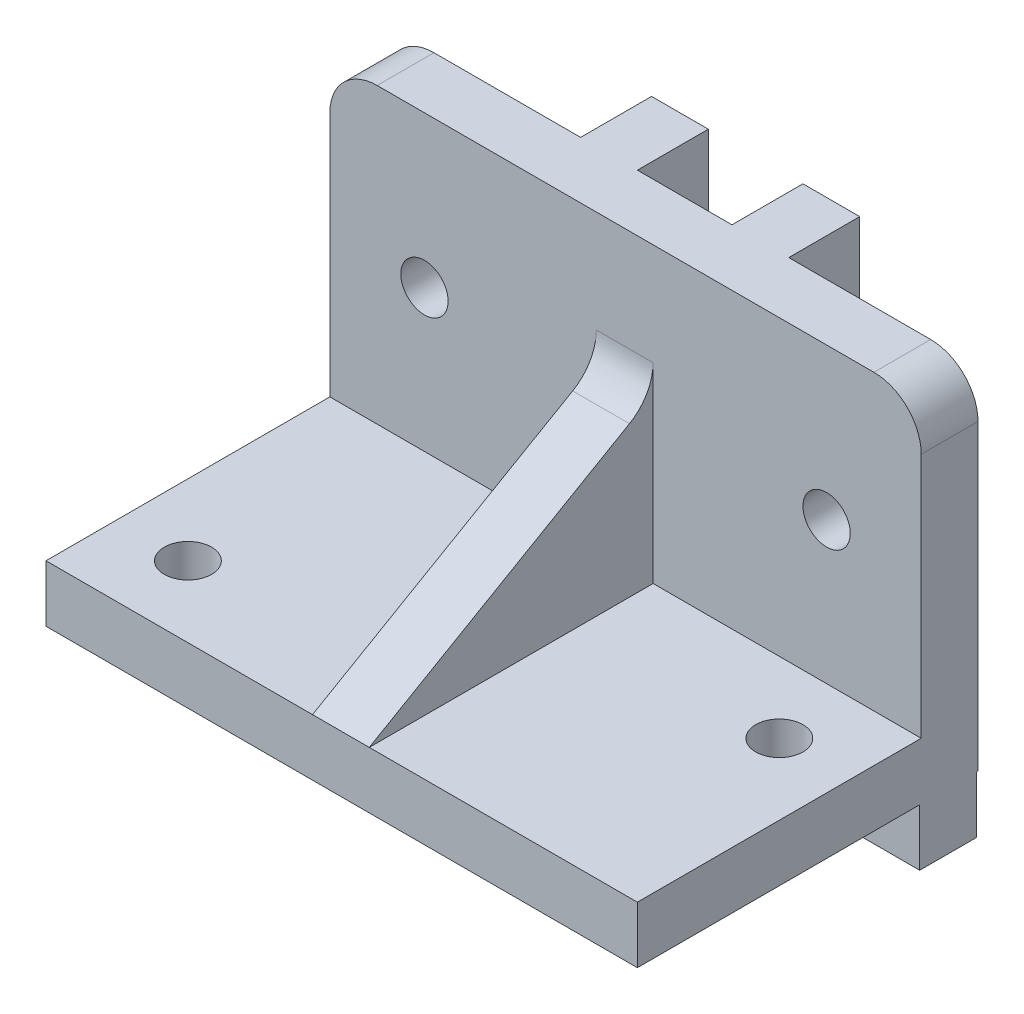
ISO-10303-21;
HEADER;
FILE_DESCRIPTION(('STEP AP214'),'2;1');
FILE_NAME('part.step','',(''),(''),'','','');
FILE_SCHEMA(('AUTOMOTIVE_DESIGN { 1 0 10303 214 1 1 1 1 }'));
ENDSEC;
DATA;
#1=APPLICATION_CONTEXT('core data for automotive mechanical design processes');
#2=APPLICATION_PROTOCOL_DEFINITION('international standard','automotive_design',2000,#1);
#3=PRODUCT_CONTEXT('',#1,'mechanical');
#4=PRODUCT('Part','Part','',(#3));
#5=PRODUCT_RELATED_PRODUCT_CATEGORY('part','',(#4));
#6=PRODUCT_DEFINITION_FORMATION('','',#4);
#7=PRODUCT_DEFINITION_CONTEXT('part definition',#1,'design');
#8=PRODUCT_DEFINITION('design','',#6,#7);
#9=PRODUCT_DEFINITION_SHAPE('','',#8);
#10=(LENGTH_UNIT() NAMED_UNIT(*) SI_UNIT(.MILLI.,.METRE.));
#11=(NAMED_UNIT(*) PLANE_ANGLE_UNIT() SI_UNIT($,.RADIAN.));
#12=(NAMED_UNIT(*) SI_UNIT($,.STERADIAN.) SOLID_ANGLE_UNIT());
#13=UNCERTAINTY_MEASURE_WITH_UNIT(LENGTH_MEASURE(1.E-05),#10,'distance_accuracy_value','');
#14=(GEOMETRIC_REPRESENTATION_CONTEXT(3) GLOBAL_UNCERTAINTY_ASSIGNED_CONTEXT((#13)) GLOBAL_UNIT_ASSIGNED_CONTEXT((#10,
#11,#12)) REPRESENTATION_CONTEXT('',''));
#15=CARTESIAN_POINT('',(0.,0.,0.));
#16=DIRECTION('',(0.,0.,1.));
#17=DIRECTION('',(1.,0.,0.));
#18=AXIS2_PLACEMENT_3D('',#15,#16,#17);
#19=CARTESIAN_POINT('',(-62.5,6.,-72.));
#20=DIRECTION('',(0.,1.,0.));
#21=DIRECTION('',(0.,0.,1.));
#22=AXIS2_PLACEMENT_3D('',#19,#20,#21);
#23=PLANE('',#22);
#24=CARTESIAN_POINT('',(-47.5,6.,-15.));
#25=DIRECTION('',(0.,1.,0.));
#26=DIRECTION('',(0.,0.,1.));
#27=AXIS2_PLACEMENT_3D('',#24,#25,#26);
#28=CIRCLE('',#27,4.99999999999999);
#29=CARTESIAN_POINT('',(-47.5,6.,-10.));
#30=VERTEX_POINT('',#29);
#31=EDGE_CURVE('E719',#30,#30,#28,.T.);
#32=ORIENTED_EDGE('',*,*,#31,.F.);
#33=EDGE_LOOP('',(#32));
#34=FACE_BOUND('',#33,.T.);
#35=DIRECTION('',(-1.,0.,0.));
#36=VECTOR('',#35,1.);
#37=CARTESIAN_POINT('',(-62.5,6.,0.));
#38=LINE('',#37,#36);
#39=CARTESIAN_POINT('',(-6.16980328317407,6.,0.));
#40=VERTEX_POINT('',#39);
#41=CARTESIAN_POINT('',(-62.5,6.,0.));
#42=VERTEX_POINT('',#41);
#43=EDGE_CURVE('E237',#40,#42,#38,.T.);
#44=ORIENTED_EDGE('',*,*,#43,.F.);
#45=DIRECTION('',(0.,0.,-1.));
#46=VECTOR('',#45,1.);
#47=CARTESIAN_POINT('',(-6.16980328317407,6.,0.));
#48=LINE('',#47,#46);
#49=CARTESIAN_POINT('',(-6.16980328317407,6.,-60.));
#50=VERTEX_POINT('',#49);
#51=EDGE_CURVE('E229',#40,#50,#48,.T.);
#52=ORIENTED_EDGE('',*,*,#51,.T.);
#53=DIRECTION('',(1.,0.,0.));
#54=VECTOR('',#53,1.);
#55=CARTESIAN_POINT('',(-62.5,6.,-60.));
#56=LINE('',#55,#54);
#57=CARTESIAN_POINT('',(-62.5,6.,-60.));
#58=VERTEX_POINT('',#57);
#59=EDGE_CURVE('E427',#58,#50,#56,.T.);
#60=ORIENTED_EDGE('',*,*,#59,.F.);
#61=DIRECTION('',(0.,0.,1.));
#62=VECTOR('',#61,1.);
#63=CARTESIAN_POINT('',(-62.5,6.,-72.));
#64=LINE('',#63,#62);
#65=EDGE_CURVE('E260',#58,#42,#64,.T.);
#66=ORIENTED_EDGE('',*,*,#65,.T.);
#67=EDGE_LOOP('',(#44,#52,#60,#66));
#68=FACE_BOUND('',#67,.T.);
#69=ADVANCED_FACE('F39',(#34,#68),#23,.T.);
#70=CARTESIAN_POINT('',(47.5,6.,-45.));
#71=DIRECTION('',(0.,1.,0.));
#72=DIRECTION('',(0.,0.,1.));
#73=AXIS2_PLACEMENT_3D('',#70,#71,#72);
#74=CIRCLE('',#73,4.99999999999999);
#75=CARTESIAN_POINT('',(47.5,6.,-40.));
#76=VERTEX_POINT('',#75);
#77=EDGE_CURVE('E597',#76,#76,#74,.T.);
#78=ORIENTED_EDGE('',*,*,#77,.F.);
#79=EDGE_LOOP('',(#78));
#80=FACE_BOUND('',#79,.T.);
#81=CARTESIAN_POINT('',(5.83019671682594,6.,-60.));
#82=VERTEX_POINT('',#81);
#83=CARTESIAN_POINT('',(62.5,6.,-60.));
#84=VERTEX_POINT('',#83);
#85=EDGE_CURVE('E227',#82,#84,#56,.T.);
#86=ORIENTED_EDGE('',*,*,#85,.F.);
#87=DIRECTION('',(0.,0.,-1.));
#88=VECTOR('',#87,1.);
#89=CARTESIAN_POINT('',(5.83019671682594,6.,0.));
#90=LINE('',#89,#88);
#91=CARTESIAN_POINT('',(5.83019671682593,6.,0.));
#92=VERTEX_POINT('',#91);
#93=EDGE_CURVE('E203',#92,#82,#90,.T.);
#94=ORIENTED_EDGE('',*,*,#93,.F.);
#95=CARTESIAN_POINT('',(62.5,6.,0.));
#96=VERTEX_POINT('',#95);
#97=EDGE_CURVE('E225',#96,#92,#38,.T.);
#98=ORIENTED_EDGE('',*,*,#97,.F.);
#99=DIRECTION('',(0.,0.,1.));
#100=VECTOR('',#99,1.);
#101=CARTESIAN_POINT('',(62.5,6.,-72.));
#102=LINE('',#101,#100);
#103=EDGE_CURVE('E264',#84,#96,#102,.T.);
#104=ORIENTED_EDGE('',*,*,#103,.F.);
#105=EDGE_LOOP('',(#86,#94,#98,#104));
#106=FACE_BOUND('',#105,.T.);
#107=ADVANCED_FACE('F223',(#80,#106),#23,.T.);
#108=CARTESIAN_POINT('',(-62.5,68.,-60.));
#109=DIRECTION('',(0.,0.,-1.));
#110=DIRECTION('',(-1.,0.,0.));
#111=AXIS2_PLACEMENT_3D('',#108,#109,#110);
#112=PLANE('',#111);
#113=CARTESIAN_POINT('',(42.5,36.,-60.));
#114=DIRECTION('',(0.,0.,1.));
#115=DIRECTION('',(1.,0.,0.));
#116=AXIS2_PLACEMENT_3D('',#113,#114,#115);
#117=CIRCLE('',#116,4.99999999999999);
#118=CARTESIAN_POINT('',(47.5,36.,-60.));
#119=VERTEX_POINT('',#118);
#120=EDGE_CURVE('E596',#119,#119,#117,.T.);
#121=ORIENTED_EDGE('',*,*,#120,.F.);
#122=EDGE_LOOP('',(#121));
#123=FACE_BOUND('',#122,.T.);
#124=CARTESIAN_POINT('',(-42.5,36.,-60.));
#125=DIRECTION('',(0.,0.,1.));
#126=DIRECTION('',(1.,0.,0.));
#127=AXIS2_PLACEMENT_3D('',#124,#125,#126);
#128=CIRCLE('',#127,4.99999999999999);
#129=CARTESIAN_POINT('',(-37.5,36.,-60.));
#130=VERTEX_POINT('',#129);
#131=EDGE_CURVE('E611',#130,#130,#128,.T.);
#132=ORIENTED_EDGE('',*,*,#131,.F.);
#133=EDGE_LOOP('',(#132));
#134=FACE_BOUND('',#133,.T.);
#135=DIRECTION('',(0.,-1.,0.));
#136=VECTOR('',#135,1.);
#137=CARTESIAN_POINT('',(-6.16980328317407,68.,-60.));
#138=LINE('',#137,#136);
#139=CARTESIAN_POINT('',(-6.16980328317407,46.4145188432739,-60.));
#140=VERTEX_POINT('',#139);
#141=EDGE_CURVE('E56',#140,#50,#138,.T.);
#142=ORIENTED_EDGE('',*,*,#141,.F.);
#143=DIRECTION('',(-1.,0.,0.));
#144=VECTOR('',#143,1.);
#145=CARTESIAN_POINT('',(5.83019671682593,46.4145188432739,-60.));
#146=LINE('',#145,#144);
#147=CARTESIAN_POINT('',(5.83019671682593,46.4145188432739,-60.));
#148=VERTEX_POINT('',#147);
#149=EDGE_CURVE('E297',#140,#148,#146,.F.);
#150=ORIENTED_EDGE('',*,*,#149,.T.);
#151=DIRECTION('',(0.,1.,0.));
#152=VECTOR('',#151,1.);
#153=CARTESIAN_POINT('',(5.83019671682592,68.,-60.));
#154=LINE('',#153,#152);
#155=EDGE_CURVE('E63',#82,#148,#154,.T.);
#156=ORIENTED_EDGE('',*,*,#155,.F.);
#157=ORIENTED_EDGE('',*,*,#85,.T.);
#158=DIRECTION('',(0.,-1.,0.));
#159=VECTOR('',#158,1.);
#160=CARTESIAN_POINT('',(62.5,68.,-60.));
#161=LINE('',#160,#159);
#162=CARTESIAN_POINT('',(62.5,58.,-60.));
#163=VERTEX_POINT('',#162);
#164=EDGE_CURVE('E431',#163,#84,#161,.T.);
#165=ORIENTED_EDGE('',*,*,#164,.F.);
#166=CARTESIAN_POINT('',(52.5,58.,-60.));
#167=DIRECTION('',(0.,0.,-1.));
#168=DIRECTION('',(-1.,0.,0.));
#169=AXIS2_PLACEMENT_3D('',#166,#167,#168);
#170=CIRCLE('',#169,10.);
#171=CARTESIAN_POINT('',(52.5,68.,-60.));
#172=VERTEX_POINT('',#171);
#173=EDGE_CURVE('E284',#163,#172,#170,.F.);
#174=ORIENTED_EDGE('',*,*,#173,.T.);
#175=DIRECTION('',(1.,0.,0.));
#176=VECTOR('',#175,1.);
#177=CARTESIAN_POINT('',(-62.5,68.,-60.));
#178=LINE('',#177,#176);
#179=CARTESIAN_POINT('',(-52.5,68.,-60.));
#180=VERTEX_POINT('',#179);
#181=EDGE_CURVE('E423',#180,#172,#178,.T.);
#182=ORIENTED_EDGE('',*,*,#181,.F.);
#183=CARTESIAN_POINT('',(-52.5,58.,-60.));
#184=DIRECTION('',(0.,0.,-1.));
#185=DIRECTION('',(-1.,0.,0.));
#186=AXIS2_PLACEMENT_3D('',#183,#184,#185);
#187=CIRCLE('',#186,10.);
#188=CARTESIAN_POINT('',(-62.5,58.,-60.));
#189=VERTEX_POINT('',#188);
#190=EDGE_CURVE('E281',#180,#189,#187,.F.);
#191=ORIENTED_EDGE('',*,*,#190,.T.);
#192=DIRECTION('',(0.,-1.,0.));
#193=VECTOR('',#192,1.);
#194=CARTESIAN_POINT('',(-62.5,68.,-60.));
#195=LINE('',#194,#193);
#196=EDGE_CURVE('E437',#189,#58,#195,.T.);
#197=ORIENTED_EDGE('',*,*,#196,.T.);
#198=ORIENTED_EDGE('',*,*,#59,.T.);
#199=EDGE_LOOP('',(#142,#150,#156,#157,#165,#174,#182,#191,#197,#198));
#200=FACE_BOUND('',#199,.T.);
#201=ADVANCED_FACE('F306',(#123,#134,#200),#112,.F.);
#202=CARTESIAN_POINT('',(-62.5,-6.,-72.));
#203=DIRECTION('',(0.,-1.,0.));
#204=DIRECTION('',(0.,0.,-1.));
#205=AXIS2_PLACEMENT_3D('',#202,#203,#204);
#206=PLANE('',#205);
#207=CARTESIAN_POINT('',(-47.5,-6.,-15.));
#208=DIRECTION('',(0.,-1.,0.));
#209=DIRECTION('',(0.,0.,-1.));
#210=AXIS2_PLACEMENT_3D('',#207,#208,#209);
#211=CIRCLE('',#210,4.99999999999999);
#212=CARTESIAN_POINT('',(-47.5,-6.,-20.));
#213=VERTEX_POINT('',#212);
#214=EDGE_CURVE('E43',#213,#213,#211,.T.);
#215=ORIENTED_EDGE('',*,*,#214,.F.);
#216=EDGE_LOOP('',(#215));
#217=FACE_BOUND('',#216,.T.);
#218=CARTESIAN_POINT('',(47.5,-6.,-45.));
#219=DIRECTION('',(0.,-1.,0.));
#220=DIRECTION('',(0.,0.,-1.));
#221=AXIS2_PLACEMENT_3D('',#218,#219,#220);
#222=CIRCLE('',#221,4.99999999999999);
#223=CARTESIAN_POINT('',(47.5,-6.,-50.));
#224=VERTEX_POINT('',#223);
#225=EDGE_CURVE('E593',#224,#224,#222,.T.);
#226=ORIENTED_EDGE('',*,*,#225,.F.);
#227=EDGE_LOOP('',(#226));
#228=FACE_BOUND('',#227,.T.);
#229=DIRECTION('',(-1.,0.,0.));
#230=VECTOR('',#229,1.);
#231=CARTESIAN_POINT('',(-62.5,-6.,-59.675154963557));
#232=LINE('',#231,#230);
#233=CARTESIAN_POINT('',(62.5,-6.,-59.675154963557));
#234=VERTEX_POINT('',#233);
#235=CARTESIAN_POINT('',(-62.5,-6.,-59.675154963557));
#236=VERTEX_POINT('',#235);
#237=EDGE_CURVE('E322',#234,#236,#232,.T.);
#238=ORIENTED_EDGE('',*,*,#237,.F.);
#239=DIRECTION('',(0.,0.,1.));
#240=VECTOR('',#239,1.);
#241=CARTESIAN_POINT('',(62.5,-6.,-72.));
#242=LINE('',#241,#240);
#243=CARTESIAN_POINT('',(62.5,-6.,0.));
#244=VERTEX_POINT('',#243);
#245=EDGE_CURVE('E254',#234,#244,#242,.T.);
#246=ORIENTED_EDGE('',*,*,#245,.T.);
#247=DIRECTION('',(1.,0.,0.));
#248=VECTOR('',#247,1.);
#249=CARTESIAN_POINT('',(-62.5,-6.,0.));
#250=LINE('',#249,#248);
#251=CARTESIAN_POINT('',(-62.5,-6.,0.));
#252=VERTEX_POINT('',#251);
#253=EDGE_CURVE('E242',#252,#244,#250,.T.);
#254=ORIENTED_EDGE('',*,*,#253,.F.);
#255=DIRECTION('',(0.,0.,1.));
#256=VECTOR('',#255,1.);
#257=CARTESIAN_POINT('',(-62.5,-6.,-72.));
#258=LINE('',#257,#256);
#259=EDGE_CURVE('E259',#236,#252,#258,.T.);
#260=ORIENTED_EDGE('',*,*,#259,.F.);
#261=EDGE_LOOP('',(#238,#246,#254,#260));
#262=FACE_BOUND('',#261,.T.);
#263=ADVANCED_FACE('F484',(#217,#228,#262),#206,.T.);
#264=CARTESIAN_POINT('',(0.,0.,-72.));
#265=DIRECTION('',(0.,0.,1.));
#266=DIRECTION('',(1.,0.,0.));
#267=AXIS2_PLACEMENT_3D('',#264,#265,#266);
#268=PLANE('',#267);
#269=DIRECTION('',(0.,-1.,0.));
#270=VECTOR('',#269,1.);
#271=CARTESIAN_POINT('',(-9.5,68.,-72.));
#272=LINE('',#271,#270);
#273=CARTESIAN_POINT('',(-9.5,68.,-72.));
#274=VERTEX_POINT('',#273);
#275=CARTESIAN_POINT('',(-9.50000000000001,-6.,-72.));
#276=VERTEX_POINT('',#275);
#277=EDGE_CURVE('E353',#274,#276,#272,.T.);
#278=ORIENTED_EDGE('',*,*,#277,.F.);
#279=DIRECTION('',(-1.,0.,0.));
#280=VECTOR('',#279,1.);
#281=CARTESIAN_POINT('',(-62.5,68.,-72.));
#282=LINE('',#281,#280);
#283=CARTESIAN_POINT('',(10.5,68.,-72.));
#284=VERTEX_POINT('',#283);
#285=EDGE_CURVE('E432',#284,#274,#282,.T.);
#286=ORIENTED_EDGE('',*,*,#285,.F.);
#287=DIRECTION('',(0.,1.,0.));
#288=VECTOR('',#287,1.);
#289=CARTESIAN_POINT('',(10.5,68.,-72.));
#290=LINE('',#289,#288);
#291=CARTESIAN_POINT('',(10.5,-6.,-72.));
#292=VERTEX_POINT('',#291);
#293=EDGE_CURVE('E392',#292,#284,#290,.T.);
#294=ORIENTED_EDGE('',*,*,#293,.F.);
#295=DIRECTION('',(1.,0.,0.));
#296=VECTOR('',#295,1.);
#297=CARTESIAN_POINT('',(-62.5,-6.,-72.));
#298=LINE('',#297,#296);
#299=EDGE_CURVE('E448',#276,#292,#298,.T.);
#300=ORIENTED_EDGE('',*,*,#299,.F.);
#301=EDGE_LOOP('',(#278,#286,#294,#300));
#302=FACE_BOUND('',#301,.T.);
#303=ADVANCED_FACE('F576',(#302),#268,.F.);
#304=CARTESIAN_POINT('',(-42.5,36.,-72.));
#305=DIRECTION('',(0.,0.,1.));
#306=DIRECTION('',(1.,0.,0.));
#307=AXIS2_PLACEMENT_3D('',#304,#305,#306);
#308=CIRCLE('',#307,4.99999999999999);
#309=CARTESIAN_POINT('',(-37.5,36.,-72.));
#310=VERTEX_POINT('',#309);
#311=EDGE_CURVE('E615',#310,#310,#308,.T.);
#312=ORIENTED_EDGE('',*,*,#311,.T.);
#313=EDGE_LOOP('',(#312));
#314=FACE_BOUND('',#313,.T.);
#315=DIRECTION('',(0.,-1.,0.));
#316=VECTOR('',#315,1.);
#317=CARTESIAN_POINT('',(-62.5,6.,-72.));
#318=LINE('',#317,#316);
#319=CARTESIAN_POINT('',(-62.5,58.,-72.));
#320=VERTEX_POINT('',#319);
#321=CARTESIAN_POINT('',(-62.5,-6.,-72.));
#322=VERTEX_POINT('',#321);
#323=EDGE_CURVE('E443',#320,#322,#318,.T.);
#324=ORIENTED_EDGE('',*,*,#323,.F.);
#325=CARTESIAN_POINT('',(-52.5,58.,-72.));
#326=DIRECTION('',(0.,0.,1.));
#327=DIRECTION('',(1.,0.,0.));
#328=AXIS2_PLACEMENT_3D('',#325,#326,#327);
#329=CIRCLE('',#328,10.);
#330=CARTESIAN_POINT('',(-52.5,68.,-72.));
#331=VERTEX_POINT('',#330);
#332=EDGE_CURVE('E291',#320,#331,#329,.F.);
#333=ORIENTED_EDGE('',*,*,#332,.T.);
#334=CARTESIAN_POINT('',(-21.5,68.,-72.));
#335=VERTEX_POINT('',#334);
#336=EDGE_CURVE('E426',#335,#331,#282,.T.);
#337=ORIENTED_EDGE('',*,*,#336,.F.);
#338=DIRECTION('',(0.,1.,0.));
#339=VECTOR('',#338,1.);
#340=CARTESIAN_POINT('',(-21.5,68.,-72.));
#341=LINE('',#340,#339);
#342=CARTESIAN_POINT('',(-21.5,-6.,-72.));
#343=VERTEX_POINT('',#342);
#344=EDGE_CURVE('E359',#343,#335,#341,.T.);
#345=ORIENTED_EDGE('',*,*,#344,.F.);
#346=EDGE_CURVE('E267',#322,#343,#298,.T.);
#347=ORIENTED_EDGE('',*,*,#346,.F.);
#348=EDGE_LOOP('',(#324,#333,#337,#345,#347));
#349=FACE_BOUND('',#348,.T.);
#350=ADVANCED_FACE('F505',(#314,#349),#268,.F.);
#351=CARTESIAN_POINT('',(42.5,36.,-72.));
#352=DIRECTION('',(0.,0.,1.));
#353=DIRECTION('',(1.,0.,0.));
#354=AXIS2_PLACEMENT_3D('',#351,#352,#353);
#355=CIRCLE('',#354,4.99999999999999);
#356=CARTESIAN_POINT('',(47.5,36.,-72.));
#357=VERTEX_POINT('',#356);
#358=EDGE_CURVE('E602',#357,#357,#355,.T.);
#359=ORIENTED_EDGE('',*,*,#358,.T.);
#360=EDGE_LOOP('',(#359));
#361=FACE_BOUND('',#360,.T.);
#362=CARTESIAN_POINT('',(52.5,68.,-72.));
#363=VERTEX_POINT('',#362);
#364=CARTESIAN_POINT('',(22.5,68.,-72.));
#365=VERTEX_POINT('',#364);
#366=EDGE_CURVE('E428',#363,#365,#282,.T.);
#367=ORIENTED_EDGE('',*,*,#366,.F.);
#368=CARTESIAN_POINT('',(52.5,58.,-72.));
#369=DIRECTION('',(0.,0.,1.));
#370=DIRECTION('',(1.,0.,0.));
#371=AXIS2_PLACEMENT_3D('',#368,#369,#370);
#372=CIRCLE('',#371,10.);
#373=CARTESIAN_POINT('',(62.5,58.,-72.));
#374=VERTEX_POINT('',#373);
#375=EDGE_CURVE('E275',#363,#374,#372,.F.);
#376=ORIENTED_EDGE('',*,*,#375,.T.);
#377=DIRECTION('',(0.,1.,0.));
#378=VECTOR('',#377,1.);
#379=CARTESIAN_POINT('',(62.5,6.,-72.));
#380=LINE('',#379,#378);
#381=CARTESIAN_POINT('',(62.5,-6.,-72.));
#382=VERTEX_POINT('',#381);
#383=EDGE_CURVE('E249',#382,#374,#380,.T.);
#384=ORIENTED_EDGE('',*,*,#383,.F.);
#385=CARTESIAN_POINT('',(22.5,-6.,-72.));
#386=VERTEX_POINT('',#385);
#387=EDGE_CURVE('E445',#386,#382,#298,.T.);
#388=ORIENTED_EDGE('',*,*,#387,.F.);
#389=DIRECTION('',(0.,-1.,0.));
#390=VECTOR('',#389,1.);
#391=CARTESIAN_POINT('',(22.5,68.,-72.));
#392=LINE('',#391,#390);
#393=EDGE_CURVE('E386',#365,#386,#392,.T.);
#394=ORIENTED_EDGE('',*,*,#393,.F.);
#395=EDGE_LOOP('',(#367,#376,#384,#388,#394));
#396=FACE_BOUND('',#395,.T.);
#397=ADVANCED_FACE('F467',(#361,#396),#268,.F.);
#398=CARTESIAN_POINT('',(62.5,6.,-72.));
#399=DIRECTION('',(1.,0.,0.));
#400=DIRECTION('',(0.,0.,-1.));
#401=AXIS2_PLACEMENT_3D('',#398,#399,#400);
#402=PLANE('',#401);
#403=ORIENTED_EDGE('',*,*,#383,.T.);
#404=DIRECTION('',(0.,0.,-1.));
#405=VECTOR('',#404,1.);
#406=CARTESIAN_POINT('',(62.5,58.,-72.));
#407=LINE('',#406,#405);
#408=EDGE_CURVE('E278',#374,#163,#407,.F.);
#409=ORIENTED_EDGE('',*,*,#408,.T.);
#410=ORIENTED_EDGE('',*,*,#164,.T.);
#411=ORIENTED_EDGE('',*,*,#103,.T.);
#412=DIRECTION('',(0.,1.,0.));
#413=VECTOR('',#412,1.);
#414=CARTESIAN_POINT('',(62.5,6.,0.));
#415=LINE('',#414,#413);
#416=EDGE_CURVE('E234',#244,#96,#415,.T.);
#417=ORIENTED_EDGE('',*,*,#416,.F.);
#418=ORIENTED_EDGE('',*,*,#245,.F.);
#419=DIRECTION('',(0.,1.,0.));
#420=VECTOR('',#419,1.);
#421=CARTESIAN_POINT('',(62.5,-18.,-59.675154963557));
#422=LINE('',#421,#420);
#423=CARTESIAN_POINT('',(62.5,-18.,-59.675154963557));
#424=VERTEX_POINT('',#423);
#425=EDGE_CURVE('E341',#424,#234,#422,.T.);
#426=ORIENTED_EDGE('',*,*,#425,.F.);
#427=DIRECTION('',(0.,0.,1.));
#428=VECTOR('',#427,1.);
#429=CARTESIAN_POINT('',(62.5,-18.,-59.675154963557));
#430=LINE('',#429,#428);
#431=CARTESIAN_POINT('',(62.5,-18.,-71.675154963557));
#432=VERTEX_POINT('',#431);
#433=EDGE_CURVE('E325',#432,#424,#430,.T.);
#434=ORIENTED_EDGE('',*,*,#433,.F.);
#435=DIRECTION('',(0.,1.,0.));
#436=VECTOR('',#435,1.);
#437=CARTESIAN_POINT('',(62.5,-18.,-71.675154963557));
#438=LINE('',#437,#436);
#439=CARTESIAN_POINT('',(62.5,-6.,-71.675154963557));
#440=VERTEX_POINT('',#439);
#441=EDGE_CURVE('E345',#432,#440,#438,.T.);
#442=ORIENTED_EDGE('',*,*,#441,.T.);
#443=EDGE_CURVE('E250',#382,#440,#242,.T.);
#444=ORIENTED_EDGE('',*,*,#443,.F.);
#445=EDGE_LOOP('',(#403,#409,#410,#411,#417,#418,#426,#434,#442,#444));
#446=FACE_BOUND('',#445,.T.);
#447=ADVANCED_FACE('F462',(#446),#402,.T.);
#448=DIRECTION('',(1.,0.,0.));
#449=VECTOR('',#448,1.);
#450=CARTESIAN_POINT('',(-62.5,-6.,-71.675154963557));
#451=LINE('',#450,#449);
#452=CARTESIAN_POINT('',(-62.5,-6.,-71.675154963557));
#453=VERTEX_POINT('',#452);
#454=EDGE_CURVE('E316',#453,#440,#451,.T.);
#455=ORIENTED_EDGE('',*,*,#454,.F.);
#456=EDGE_CURVE('E255',#322,#453,#258,.T.);
#457=ORIENTED_EDGE('',*,*,#456,.F.);
#458=ORIENTED_EDGE('',*,*,#346,.T.);
#459=DIRECTION('',(0.,0.,1.));
#460=VECTOR('',#459,1.);
#461=CARTESIAN_POINT('',(-21.5,-6.,-87.));
#462=LINE('',#461,#460);
#463=CARTESIAN_POINT('',(-21.5,-6.,-87.));
#464=VERTEX_POINT('',#463);
#465=EDGE_CURVE('E380',#464,#343,#462,.T.);
#466=ORIENTED_EDGE('',*,*,#465,.F.);
#467=DIRECTION('',(-1.,0.,0.));
#468=VECTOR('',#467,1.);
#469=CARTESIAN_POINT('',(-9.50000000000001,-6.,-87.));
#470=LINE('',#469,#468);
#471=CARTESIAN_POINT('',(-9.50000000000001,-6.,-87.));
#472=VERTEX_POINT('',#471);
#473=EDGE_CURVE('E358',#472,#464,#470,.T.);
#474=ORIENTED_EDGE('',*,*,#473,.F.);
#475=DIRECTION('',(0.,0.,1.));
#476=VECTOR('',#475,1.);
#477=CARTESIAN_POINT('',(-9.50000000000001,-6.,-87.));
#478=LINE('',#477,#476);
#479=EDGE_CURVE('E383',#472,#276,#478,.T.);
#480=ORIENTED_EDGE('',*,*,#479,.T.);
#481=ORIENTED_EDGE('',*,*,#299,.T.);
#482=DIRECTION('',(0.,0.,1.));
#483=VECTOR('',#482,1.);
#484=CARTESIAN_POINT('',(10.5,-6.,-87.));
#485=LINE('',#484,#483);
#486=CARTESIAN_POINT('',(10.5,-6.,-87.));
#487=VERTEX_POINT('',#486);
#488=EDGE_CURVE('E415',#487,#292,#485,.T.);
#489=ORIENTED_EDGE('',*,*,#488,.F.);
#490=DIRECTION('',(-1.,0.,0.));
#491=VECTOR('',#490,1.);
#492=CARTESIAN_POINT('',(22.5,-6.,-87.));
#493=LINE('',#492,#491);
#494=CARTESIAN_POINT('',(22.5,-6.,-87.));
#495=VERTEX_POINT('',#494);
#496=EDGE_CURVE('E391',#495,#487,#493,.T.);
#497=ORIENTED_EDGE('',*,*,#496,.F.);
#498=DIRECTION('',(0.,0.,1.));
#499=VECTOR('',#498,1.);
#500=CARTESIAN_POINT('',(22.5,-6.,-87.));
#501=LINE('',#500,#499);
#502=EDGE_CURVE('E419',#495,#386,#501,.T.);
#503=ORIENTED_EDGE('',*,*,#502,.T.);
#504=ORIENTED_EDGE('',*,*,#387,.T.);
#505=ORIENTED_EDGE('',*,*,#443,.T.);
#506=EDGE_LOOP('',(#455,#457,#458,#466,#474,#480,#481,#489,#497,#503,#504,#505));
#507=FACE_BOUND('',#506,.T.);
#508=ADVANCED_FACE('F456',(#507),#206,.T.);
#509=CARTESIAN_POINT('',(-62.5,6.,-72.));
#510=DIRECTION('',(-1.,0.,0.));
#511=DIRECTION('',(0.,0.,1.));
#512=AXIS2_PLACEMENT_3D('',#509,#510,#511);
#513=PLANE('',#512);
#514=ORIENTED_EDGE('',*,*,#196,.F.);
#515=DIRECTION('',(0.,0.,1.));
#516=VECTOR('',#515,1.);
#517=CARTESIAN_POINT('',(-62.5,58.,-72.));
#518=LINE('',#517,#516);
#519=EDGE_CURVE('E288',#189,#320,#518,.F.);
#520=ORIENTED_EDGE('',*,*,#519,.T.);
#521=ORIENTED_EDGE('',*,*,#323,.T.);
#522=ORIENTED_EDGE('',*,*,#456,.T.);
#523=DIRECTION('',(0.,1.,0.));
#524=VECTOR('',#523,1.);
#525=CARTESIAN_POINT('',(-62.5,-18.,-71.675154963557));
#526=LINE('',#525,#524);
#527=CARTESIAN_POINT('',(-62.5,-18.,-71.675154963557));
#528=VERTEX_POINT('',#527);
#529=EDGE_CURVE('E349',#528,#453,#526,.T.);
#530=ORIENTED_EDGE('',*,*,#529,.F.);
#531=DIRECTION('',(0.,0.,-1.));
#532=VECTOR('',#531,1.);
#533=CARTESIAN_POINT('',(-62.5,-18.,-59.675154963557));
#534=LINE('',#533,#532);
#535=CARTESIAN_POINT('',(-62.5,-18.,-59.675154963557));
#536=VERTEX_POINT('',#535);
#537=EDGE_CURVE('E317',#536,#528,#534,.T.);
#538=ORIENTED_EDGE('',*,*,#537,.F.);
#539=DIRECTION('',(0.,1.,0.));
#540=VECTOR('',#539,1.);
#541=CARTESIAN_POINT('',(-62.5,-18.,-59.675154963557));
#542=LINE('',#541,#540);
#543=EDGE_CURVE('E331',#536,#236,#542,.T.);
#544=ORIENTED_EDGE('',*,*,#543,.T.);
#545=ORIENTED_EDGE('',*,*,#259,.T.);
#546=DIRECTION('',(0.,-1.,0.));
#547=VECTOR('',#546,1.);
#548=CARTESIAN_POINT('',(-62.5,6.,0.));
#549=LINE('',#548,#547);
#550=EDGE_CURVE('E236',#42,#252,#549,.T.);
#551=ORIENTED_EDGE('',*,*,#550,.F.);
#552=ORIENTED_EDGE('',*,*,#65,.F.);
#553=EDGE_LOOP('',(#514,#520,#521,#522,#530,#538,#544,#545,#551,#552));
#554=FACE_BOUND('',#553,.T.);
#555=ADVANCED_FACE('F489',(#554),#513,.T.);
#556=CARTESIAN_POINT('',(0.,0.,0.));
#557=DIRECTION('',(0.,0.,1.));
#558=DIRECTION('',(1.,0.,0.));
#559=AXIS2_PLACEMENT_3D('',#556,#557,#558);
#560=PLANE('',#559);
#561=DIRECTION('',(-1.,0.,0.));
#562=VECTOR('',#561,1.);
#563=CARTESIAN_POINT('',(5.83019671682593,6.,0.));
#564=LINE('',#563,#562);
#565=EDGE_CURVE('E209',#92,#40,#564,.T.);
#566=ORIENTED_EDGE('',*,*,#565,.T.);
#567=ORIENTED_EDGE('',*,*,#43,.T.);
#568=ORIENTED_EDGE('',*,*,#550,.T.);
#569=ORIENTED_EDGE('',*,*,#253,.T.);
#570=ORIENTED_EDGE('',*,*,#416,.T.);
#571=ORIENTED_EDGE('',*,*,#97,.T.);
#572=EDGE_LOOP('',(#566,#567,#568,#569,#570,#571));
#573=FACE_BOUND('',#572,.T.);
#574=ADVANCED_FACE('F231',(#573),#560,.T.);
#575=CARTESIAN_POINT('',(0.,68.,0.));
#576=DIRECTION('',(0.,1.,0.));
#577=DIRECTION('',(0.,0.,1.));
#578=AXIS2_PLACEMENT_3D('',#575,#576,#577);
#579=PLANE('',#578);
#580=ORIENTED_EDGE('',*,*,#181,.T.);
#581=DIRECTION('',(0.,0.,-1.));
#582=VECTOR('',#581,1.);
#583=CARTESIAN_POINT('',(52.5,68.,0.));
#584=LINE('',#583,#582);
#585=EDGE_CURVE('E271',#172,#363,#584,.T.);
#586=ORIENTED_EDGE('',*,*,#585,.T.);
#587=ORIENTED_EDGE('',*,*,#366,.T.);
#588=DIRECTION('',(0.,0.,1.));
#589=VECTOR('',#588,1.);
#590=CARTESIAN_POINT('',(22.5,68.,-87.));
#591=LINE('',#590,#589);
#592=CARTESIAN_POINT('',(22.5,68.,-87.));
#593=VERTEX_POINT('',#592);
#594=EDGE_CURVE('E401',#593,#365,#591,.T.);
#595=ORIENTED_EDGE('',*,*,#594,.F.);
#596=DIRECTION('',(1.,0.,0.));
#597=VECTOR('',#596,1.);
#598=CARTESIAN_POINT('',(22.5,68.,-87.));
#599=LINE('',#598,#597);
#600=CARTESIAN_POINT('',(10.5,68.,-87.));
#601=VERTEX_POINT('',#600);
#602=EDGE_CURVE('E398',#601,#593,#599,.T.);
#603=ORIENTED_EDGE('',*,*,#602,.F.);
#604=DIRECTION('',(0.,0.,1.));
#605=VECTOR('',#604,1.);
#606=CARTESIAN_POINT('',(10.5,68.,-87.));
#607=LINE('',#606,#605);
#608=EDGE_CURVE('E411',#601,#284,#607,.T.);
#609=ORIENTED_EDGE('',*,*,#608,.T.);
#610=ORIENTED_EDGE('',*,*,#285,.T.);
#611=DIRECTION('',(0.,0.,1.));
#612=VECTOR('',#611,1.);
#613=CARTESIAN_POINT('',(-9.5,68.,-87.));
#614=LINE('',#613,#612);
#615=CARTESIAN_POINT('',(-9.5,68.,-87.));
#616=VERTEX_POINT('',#615);
#617=EDGE_CURVE('E368',#616,#274,#614,.T.);
#618=ORIENTED_EDGE('',*,*,#617,.F.);
#619=DIRECTION('',(1.,0.,0.));
#620=VECTOR('',#619,1.);
#621=CARTESIAN_POINT('',(-9.5,68.,-87.));
#622=LINE('',#621,#620);
#623=CARTESIAN_POINT('',(-21.5,68.,-87.));
#624=VERTEX_POINT('',#623);
#625=EDGE_CURVE('E365',#624,#616,#622,.T.);
#626=ORIENTED_EDGE('',*,*,#625,.F.);
#627=DIRECTION('',(0.,0.,1.));
#628=VECTOR('',#627,1.);
#629=CARTESIAN_POINT('',(-21.5,68.,-87.));
#630=LINE('',#629,#628);
#631=EDGE_CURVE('E377',#624,#335,#630,.T.);
#632=ORIENTED_EDGE('',*,*,#631,.T.);
#633=ORIENTED_EDGE('',*,*,#336,.T.);
#634=DIRECTION('',(0.,0.,1.));
#635=VECTOR('',#634,1.);
#636=CARTESIAN_POINT('',(-52.5,68.,0.));
#637=LINE('',#636,#635);
#638=EDGE_CURVE('E253',#331,#180,#637,.T.);
#639=ORIENTED_EDGE('',*,*,#638,.T.);
#640=EDGE_LOOP('',(#580,#586,#587,#595,#603,#609,#610,#618,#626,#632,#633,#639));
#641=FACE_BOUND('',#640,.T.);
#642=ADVANCED_FACE('F473',(#641),#579,.T.);
#643=CARTESIAN_POINT('',(22.5,68.,-87.));
#644=DIRECTION('',(-1.,0.,0.));
#645=DIRECTION('',(0.,-1.,0.));
#646=AXIS2_PLACEMENT_3D('',#643,#644,#645);
#647=PLANE('',#646);
#648=ORIENTED_EDGE('',*,*,#393,.T.);
#649=ORIENTED_EDGE('',*,*,#502,.F.);
#650=DIRECTION('',(0.,-1.,0.));
#651=VECTOR('',#650,1.);
#652=CARTESIAN_POINT('',(22.5,68.,-87.));
#653=LINE('',#652,#651);
#654=EDGE_CURVE('E387',#593,#495,#653,.T.);
#655=ORIENTED_EDGE('',*,*,#654,.F.);
#656=ORIENTED_EDGE('',*,*,#594,.T.);
#657=EDGE_LOOP('',(#648,#649,#655,#656));
#658=FACE_BOUND('',#657,.T.);
#659=ADVANCED_FACE('F563',(#658),#647,.F.);
#660=CARTESIAN_POINT('',(10.5,68.,-87.));
#661=DIRECTION('',(1.,0.,0.));
#662=DIRECTION('',(0.,1.,0.));
#663=AXIS2_PLACEMENT_3D('',#660,#661,#662);
#664=PLANE('',#663);
#665=ORIENTED_EDGE('',*,*,#293,.T.);
#666=ORIENTED_EDGE('',*,*,#608,.F.);
#667=DIRECTION('',(0.,1.,0.));
#668=VECTOR('',#667,1.);
#669=CARTESIAN_POINT('',(10.5,68.,-87.));
#670=LINE('',#669,#668);
#671=EDGE_CURVE('E395',#487,#601,#670,.T.);
#672=ORIENTED_EDGE('',*,*,#671,.F.);
#673=ORIENTED_EDGE('',*,*,#488,.T.);
#674=EDGE_LOOP('',(#665,#666,#672,#673));
#675=FACE_BOUND('',#674,.T.);
#676=ADVANCED_FACE('F559',(#675),#664,.F.);
#677=CARTESIAN_POINT('',(0.,0.,-87.));
#678=DIRECTION('',(0.,0.,-1.));
#679=DIRECTION('',(-1.,0.,0.));
#680=AXIS2_PLACEMENT_3D('',#677,#678,#679);
#681=PLANE('',#680);
#682=ORIENTED_EDGE('',*,*,#654,.T.);
#683=ORIENTED_EDGE('',*,*,#496,.T.);
#684=ORIENTED_EDGE('',*,*,#671,.T.);
#685=ORIENTED_EDGE('',*,*,#602,.T.);
#686=EDGE_LOOP('',(#682,#683,#684,#685));
#687=FACE_BOUND('',#686,.T.);
#688=ADVANCED_FACE('F555',(#687),#681,.T.);
#689=CARTESIAN_POINT('',(-9.5,68.,-87.));
#690=DIRECTION('',(-1.,0.,0.));
#691=DIRECTION('',(0.,-1.,0.));
#692=AXIS2_PLACEMENT_3D('',#689,#690,#691);
#693=PLANE('',#692);
#694=ORIENTED_EDGE('',*,*,#277,.T.);
#695=ORIENTED_EDGE('',*,*,#479,.F.);
#696=DIRECTION('',(0.,-1.,0.));
#697=VECTOR('',#696,1.);
#698=CARTESIAN_POINT('',(-9.5,68.,-87.));
#699=LINE('',#698,#697);
#700=EDGE_CURVE('E354',#616,#472,#699,.T.);
#701=ORIENTED_EDGE('',*,*,#700,.F.);
#702=ORIENTED_EDGE('',*,*,#617,.T.);
#703=EDGE_LOOP('',(#694,#695,#701,#702));
#704=FACE_BOUND('',#703,.T.);
#705=ADVANCED_FACE('F551',(#704),#693,.F.);
#706=CARTESIAN_POINT('',(-21.5,68.,-87.));
#707=DIRECTION('',(1.,0.,0.));
#708=DIRECTION('',(0.,1.,0.));
#709=AXIS2_PLACEMENT_3D('',#706,#707,#708);
#710=PLANE('',#709);
#711=ORIENTED_EDGE('',*,*,#344,.T.);
#712=ORIENTED_EDGE('',*,*,#631,.F.);
#713=DIRECTION('',(0.,1.,0.));
#714=VECTOR('',#713,1.);
#715=CARTESIAN_POINT('',(-21.5,68.,-87.));
#716=LINE('',#715,#714);
#717=EDGE_CURVE('E362',#464,#624,#716,.T.);
#718=ORIENTED_EDGE('',*,*,#717,.F.);
#719=ORIENTED_EDGE('',*,*,#465,.T.);
#720=EDGE_LOOP('',(#711,#712,#718,#719));
#721=FACE_BOUND('',#720,.T.);
#722=ADVANCED_FACE('F547',(#721),#710,.F.);
#723=CARTESIAN_POINT('',(0.,0.,-87.));
#724=DIRECTION('',(0.,0.,-1.));
#725=DIRECTION('',(-1.,0.,0.));
#726=AXIS2_PLACEMENT_3D('',#723,#724,#725);
#727=PLANE('',#726);
#728=ORIENTED_EDGE('',*,*,#700,.T.);
#729=ORIENTED_EDGE('',*,*,#473,.T.);
#730=ORIENTED_EDGE('',*,*,#717,.T.);
#731=ORIENTED_EDGE('',*,*,#625,.T.);
#732=EDGE_LOOP('',(#728,#729,#730,#731));
#733=FACE_BOUND('',#732,.T.);
#734=ADVANCED_FACE('F544',(#733),#727,.T.);
#735=CARTESIAN_POINT('',(-62.5,-18.,-71.675154963557));
#736=DIRECTION('',(0.,0.,1.));
#737=DIRECTION('',(1.,0.,0.));
#738=AXIS2_PLACEMENT_3D('',#735,#736,#737);
#739=PLANE('',#738);
#740=ORIENTED_EDGE('',*,*,#454,.T.);
#741=ORIENTED_EDGE('',*,*,#441,.F.);
#742=DIRECTION('',(1.,0.,0.));
#743=VECTOR('',#742,1.);
#744=CARTESIAN_POINT('',(-62.5,-18.,-71.675154963557));
#745=LINE('',#744,#743);
#746=EDGE_CURVE('E321',#528,#432,#745,.T.);
#747=ORIENTED_EDGE('',*,*,#746,.F.);
#748=ORIENTED_EDGE('',*,*,#529,.T.);
#749=EDGE_LOOP('',(#740,#741,#747,#748));
#750=FACE_BOUND('',#749,.T.);
#751=ADVANCED_FACE('F500',(#750),#739,.F.);
#752=CARTESIAN_POINT('',(-62.5,-18.,-59.675154963557));
#753=DIRECTION('',(0.,0.,-1.));
#754=DIRECTION('',(-1.,0.,0.));
#755=AXIS2_PLACEMENT_3D('',#752,#753,#754);
#756=PLANE('',#755);
#757=ORIENTED_EDGE('',*,*,#237,.T.);
#758=ORIENTED_EDGE('',*,*,#543,.F.);
#759=DIRECTION('',(-1.,0.,0.));
#760=VECTOR('',#759,1.);
#761=CARTESIAN_POINT('',(-62.5,-18.,-59.675154963557));
#762=LINE('',#761,#760);
#763=EDGE_CURVE('E328',#424,#536,#762,.T.);
#764=ORIENTED_EDGE('',*,*,#763,.F.);
#765=ORIENTED_EDGE('',*,*,#425,.T.);
#766=EDGE_LOOP('',(#757,#758,#764,#765));
#767=FACE_BOUND('',#766,.T.);
#768=ADVANCED_FACE('F496',(#767),#756,.F.);
#769=CARTESIAN_POINT('',(0.,-18.,0.));
#770=DIRECTION('',(0.,-1.,0.));
#771=DIRECTION('',(0.,0.,-1.));
#772=AXIS2_PLACEMENT_3D('',#769,#770,#771);
#773=PLANE('',#772);
#774=ORIENTED_EDGE('',*,*,#537,.T.);
#775=ORIENTED_EDGE('',*,*,#746,.T.);
#776=ORIENTED_EDGE('',*,*,#433,.T.);
#777=ORIENTED_EDGE('',*,*,#763,.T.);
#778=EDGE_LOOP('',(#774,#775,#776,#777));
#779=FACE_BOUND('',#778,.T.);
#780=ADVANCED_FACE('F498',(#779),#773,.T.);
#781=CARTESIAN_POINT('',(52.5,58.,0.));
#782=DIRECTION('',(0.,0.,-1.));
#783=DIRECTION('',(-1.,0.,0.));
#784=AXIS2_PLACEMENT_3D('',#781,#782,#783);
#785=CYLINDRICAL_SURFACE('',#784,10.);
#786=ORIENTED_EDGE('',*,*,#173,.F.);
#787=ORIENTED_EDGE('',*,*,#408,.F.);
#788=ORIENTED_EDGE('',*,*,#375,.F.);
#789=ORIENTED_EDGE('',*,*,#585,.F.);
#790=EDGE_LOOP('',(#786,#787,#788,#789));
#791=FACE_BOUND('',#790,.T.);
#792=ADVANCED_FACE('F471',(#791),#785,.T.);
#793=CARTESIAN_POINT('',(-52.5,58.,0.));
#794=DIRECTION('',(0.,0.,1.));
#795=DIRECTION('',(1.,0.,0.));
#796=AXIS2_PLACEMENT_3D('',#793,#794,#795);
#797=CYLINDRICAL_SURFACE('',#796,10.);
#798=ORIENTED_EDGE('',*,*,#332,.F.);
#799=ORIENTED_EDGE('',*,*,#519,.F.);
#800=ORIENTED_EDGE('',*,*,#190,.F.);
#801=ORIENTED_EDGE('',*,*,#638,.F.);
#802=EDGE_LOOP('',(#798,#799,#800,#801));
#803=FACE_BOUND('',#802,.T.);
#804=ADVANCED_FACE('F509',(#803),#797,.T.);
#805=CARTESIAN_POINT('',(-6.16980328317407,68.,0.));
#806=DIRECTION('',(1.,0.,0.));
#807=DIRECTION('',(0.,0.,-1.));
#808=AXIS2_PLACEMENT_3D('',#805,#806,#807);
#809=PLANE('',#808);
#810=ORIENTED_EDGE('',*,*,#51,.F.);
#811=DIRECTION('',(0.,-0.500000000000001,0.866025403784438));
#812=VECTOR('',#811,1.);
#813=CARTESIAN_POINT('',(-6.16980328317407,6.,0.));
#814=LINE('',#813,#812);
#815=CARTESIAN_POINT('',(-6.16980328317407,37.7542648054295,-55.));
#816=VERTEX_POINT('',#815);
#817=EDGE_CURVE('E210',#816,#40,#814,.T.);
#818=ORIENTED_EDGE('',*,*,#817,.F.);
#819=CARTESIAN_POINT('',(-6.16980328317407,46.4145188432739,-50.));
#820=DIRECTION('',(1.,0.,0.));
#821=DIRECTION('',(0.,0.,-1.));
#822=AXIS2_PLACEMENT_3D('',#819,#820,#821);
#823=CIRCLE('',#822,10.);
#824=EDGE_CURVE('E49',#816,#140,#823,.T.);
#825=ORIENTED_EDGE('',*,*,#824,.T.);
#826=ORIENTED_EDGE('',*,*,#141,.T.);
#827=EDGE_LOOP('',(#810,#818,#825,#826));
#828=FACE_BOUND('',#827,.T.);
#829=ADVANCED_FACE('F303',(#828),#809,.F.);
#830=CARTESIAN_POINT('',(5.83019671682592,68.,0.));
#831=DIRECTION('',(-1.,0.,0.));
#832=DIRECTION('',(0.,-1.,0.));
#833=AXIS2_PLACEMENT_3D('',#830,#831,#832);
#834=PLANE('',#833);
#835=ORIENTED_EDGE('',*,*,#155,.T.);
#836=CARTESIAN_POINT('',(5.83019671682593,46.4145188432739,-50.));
#837=DIRECTION('',(-1.,0.,0.));
#838=DIRECTION('',(0.,-1.,0.));
#839=AXIS2_PLACEMENT_3D('',#836,#837,#838);
#840=CIRCLE('',#839,10.);
#841=CARTESIAN_POINT('',(5.83019671682593,37.7542648054295,-55.));
#842=VERTEX_POINT('',#841);
#843=EDGE_CURVE('E11',#148,#842,#840,.T.);
#844=ORIENTED_EDGE('',*,*,#843,.T.);
#845=DIRECTION('',(0.,-0.500000000000001,0.866025403784438));
#846=VECTOR('',#845,1.);
#847=CARTESIAN_POINT('',(5.83019671682593,6.,0.));
#848=LINE('',#847,#846);
#849=EDGE_CURVE('E199',#842,#92,#848,.T.);
#850=ORIENTED_EDGE('',*,*,#849,.T.);
#851=ORIENTED_EDGE('',*,*,#93,.T.);
#852=EDGE_LOOP('',(#835,#844,#850,#851));
#853=FACE_BOUND('',#852,.T.);
#854=ADVANCED_FACE('F201',(#853),#834,.F.);
#855=CARTESIAN_POINT('',(5.83019671682593,6.,0.));
#856=DIRECTION('',(0.,-0.866025403784438,-0.500000000000001));
#857=DIRECTION('',(0.,0.500000000000001,-0.866025403784438));
#858=AXIS2_PLACEMENT_3D('',#855,#856,#857);
#859=PLANE('',#858);
#860=ORIENTED_EDGE('',*,*,#849,.F.);
#861=DIRECTION('',(-1.,0.,0.));
#862=VECTOR('',#861,1.);
#863=CARTESIAN_POINT('',(-6.16980328317407,37.7542648054295,-55.));
#864=LINE('',#863,#862);
#865=EDGE_CURVE('E294',#842,#816,#864,.T.);
#866=ORIENTED_EDGE('',*,*,#865,.T.);
#867=ORIENTED_EDGE('',*,*,#817,.T.);
#868=ORIENTED_EDGE('',*,*,#565,.F.);
#869=EDGE_LOOP('',(#860,#866,#867,#868));
#870=FACE_BOUND('',#869,.T.);
#871=ADVANCED_FACE('F213',(#870),#859,.F.);
#872=CARTESIAN_POINT('',(5.83019671682593,46.4145188432739,-50.));
#873=DIRECTION('',(1.,0.,0.));
#874=DIRECTION('',(0.,0.,-1.));
#875=AXIS2_PLACEMENT_3D('',#872,#873,#874);
#876=CYLINDRICAL_SURFACE('',#875,10.);
#877=ORIENTED_EDGE('',*,*,#843,.F.);
#878=ORIENTED_EDGE('',*,*,#149,.F.);
#879=ORIENTED_EDGE('',*,*,#824,.F.);
#880=ORIENTED_EDGE('',*,*,#865,.F.);
#881=EDGE_LOOP('',(#877,#878,#879,#880));
#882=FACE_BOUND('',#881,.T.);
#883=ADVANCED_FACE('F41',(#882),#876,.F.);
#884=CARTESIAN_POINT('',(-42.5,36.,-60.));
#885=DIRECTION('',(0.,0.,1.));
#886=DIRECTION('',(1.,0.,0.));
#887=AXIS2_PLACEMENT_3D('',#884,#885,#886);
#888=CYLINDRICAL_SURFACE('',#887,4.99999999999999);
#889=ORIENTED_EDGE('',*,*,#131,.T.);
#890=EDGE_LOOP('',(#889));
#891=FACE_BOUND('',#890,.T.);
#892=ORIENTED_EDGE('',*,*,#311,.F.);
#893=EDGE_LOOP('',(#892));
#894=FACE_BOUND('',#893,.T.);
#895=ADVANCED_FACE('F623',(#891,#894),#888,.F.);
#896=CARTESIAN_POINT('',(42.5,36.,-60.));
#897=DIRECTION('',(0.,0.,1.));
#898=DIRECTION('',(1.,0.,0.));
#899=AXIS2_PLACEMENT_3D('',#896,#897,#898);
#900=CYLINDRICAL_SURFACE('',#899,4.99999999999999);
#901=ORIENTED_EDGE('',*,*,#120,.T.);
#902=EDGE_LOOP('',(#901));
#903=FACE_BOUND('',#902,.T.);
#904=ORIENTED_EDGE('',*,*,#358,.F.);
#905=EDGE_LOOP('',(#904));
#906=FACE_BOUND('',#905,.T.);
#907=ADVANCED_FACE('F625',(#903,#906),#900,.F.);
#908=CARTESIAN_POINT('',(47.5,6.,-45.));
#909=DIRECTION('',(0.,1.,0.));
#910=DIRECTION('',(0.,0.,1.));
#911=AXIS2_PLACEMENT_3D('',#908,#909,#910);
#912=CYLINDRICAL_SURFACE('',#911,4.99999999999999);
#913=ORIENTED_EDGE('',*,*,#225,.T.);
#914=EDGE_LOOP('',(#913));
#915=FACE_BOUND('',#914,.T.);
#916=ORIENTED_EDGE('',*,*,#77,.T.);
#917=EDGE_LOOP('',(#916));
#918=FACE_BOUND('',#917,.T.);
#919=ADVANCED_FACE('F632',(#915,#918),#912,.F.);
#920=CARTESIAN_POINT('',(-47.5,6.,-15.));
#921=DIRECTION('',(0.,1.,0.));
#922=DIRECTION('',(0.,0.,1.));
#923=AXIS2_PLACEMENT_3D('',#920,#921,#922);
#924=CYLINDRICAL_SURFACE('',#923,4.99999999999999);
#925=ORIENTED_EDGE('',*,*,#214,.T.);
#926=EDGE_LOOP('',(#925));
#927=FACE_BOUND('',#926,.T.);
#928=ORIENTED_EDGE('',*,*,#31,.T.);
#929=EDGE_LOOP('',(#928));
#930=FACE_BOUND('',#929,.T.);
#931=ADVANCED_FACE('F705',(#927,#930),#924,.F.);
#932=CLOSED_SHELL('',(#69,#107,#201,#263,#303,#350,#397,#447,#508,#555,#574,#642,#659,#676,#688,
#705,#722,#734,#751,#768,#780,#792,#804,#829,#854,#871,#883,#895,#907,#919,#931));
#933=MANIFOLD_SOLID_BREP('B2',#932);
#934=ADVANCED_BREP_SHAPE_REPRESENTATION('',(#18,#933),#14);
#935=SHAPE_DEFINITION_REPRESENTATION(#9,#934);
ENDSEC;
END-ISO-10303-21;
